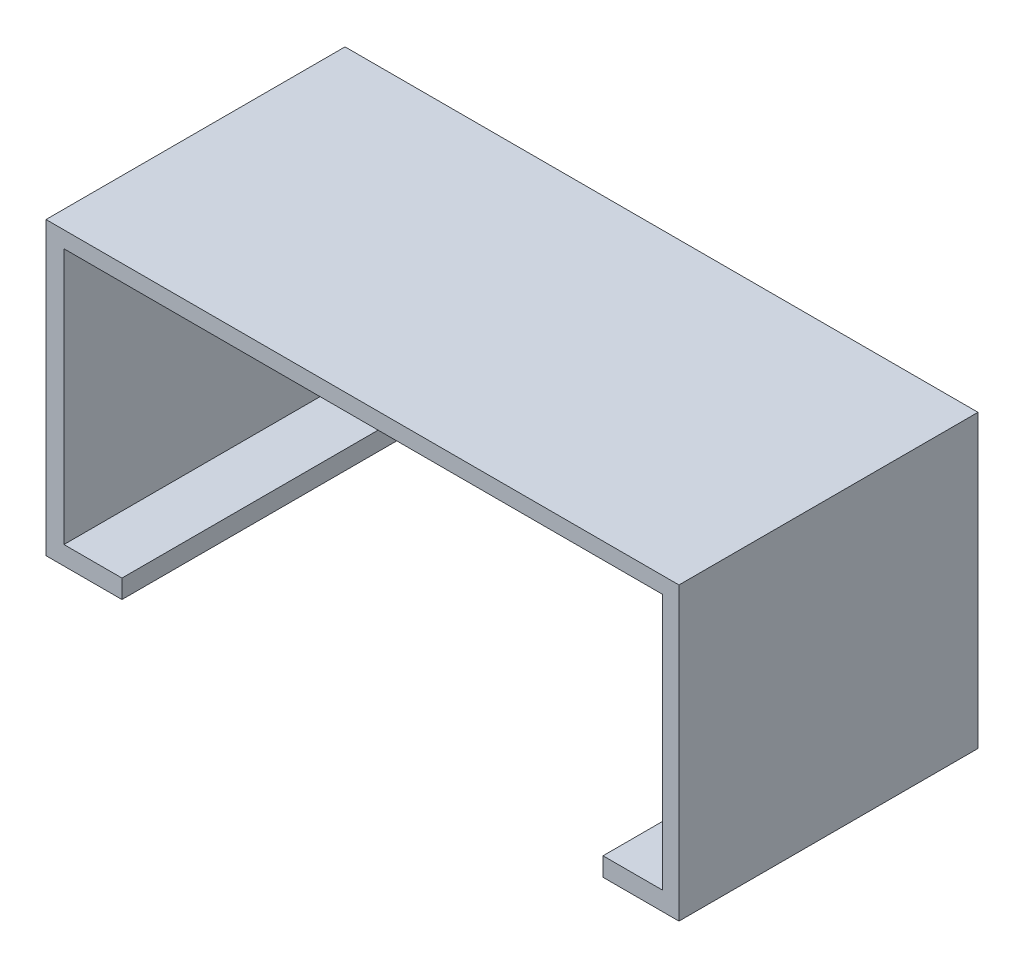
ISO-10303-21;
HEADER;
FILE_DESCRIPTION(('STEP AP214'),'2;1');
FILE_NAME('part.step','',(''),(''),'','','');
FILE_SCHEMA(('AUTOMOTIVE_DESIGN { 1 0 10303 214 1 1 1 1 }'));
ENDSEC;
DATA;
#1=APPLICATION_CONTEXT('core data for automotive mechanical design processes');
#2=APPLICATION_PROTOCOL_DEFINITION('international standard','automotive_design',2000,#1);
#3=PRODUCT_CONTEXT('',#1,'mechanical');
#4=PRODUCT('Part','Part','',(#3));
#5=PRODUCT_RELATED_PRODUCT_CATEGORY('part','',(#4));
#6=PRODUCT_DEFINITION_FORMATION('','',#4);
#7=PRODUCT_DEFINITION_CONTEXT('part definition',#1,'design');
#8=PRODUCT_DEFINITION('design','',#6,#7);
#9=PRODUCT_DEFINITION_SHAPE('','',#8);
#10=(LENGTH_UNIT() NAMED_UNIT(*) SI_UNIT(.MILLI.,.METRE.));
#11=(NAMED_UNIT(*) PLANE_ANGLE_UNIT() SI_UNIT($,.RADIAN.));
#12=(NAMED_UNIT(*) SI_UNIT($,.STERADIAN.) SOLID_ANGLE_UNIT());
#13=UNCERTAINTY_MEASURE_WITH_UNIT(LENGTH_MEASURE(1.E-05),#10,'distance_accuracy_value','');
#14=(GEOMETRIC_REPRESENTATION_CONTEXT(3) GLOBAL_UNCERTAINTY_ASSIGNED_CONTEXT((#13)) GLOBAL_UNIT_ASSIGNED_CONTEXT((#10,
#11,#12)) REPRESENTATION_CONTEXT('',''));
#15=CARTESIAN_POINT('',(0.,0.,0.));
#16=DIRECTION('',(0.,0.,1.));
#17=DIRECTION('',(1.,0.,0.));
#18=AXIS2_PLACEMENT_3D('',#15,#16,#17);
#19=CARTESIAN_POINT('',(-4.826,-2.54700024,0.));
#20=DIRECTION('',(1.,0.,0.));
#21=DIRECTION('',(0.,0.,-1.));
#22=AXIS2_PLACEMENT_3D('',#19,#20,#21);
#23=PLANE('',#22);
#24=DIRECTION('',(0.,0.,-1.));
#25=VECTOR('',#24,1.);
#26=CARTESIAN_POINT('',(-4.826,-2.921,0.));
#27=LINE('',#26,#25);
#28=CARTESIAN_POINT('',(-4.826,-2.921,0.));
#29=VERTEX_POINT('',#28);
#30=CARTESIAN_POINT('',(-4.826,-2.921,6.0000007));
#31=VERTEX_POINT('',#30);
#32=EDGE_CURVE('E157',#29,#31,#27,.F.);
#33=ORIENTED_EDGE('',*,*,#32,.F.);
#34=DIRECTION('',(0.,1.,0.));
#35=VECTOR('',#34,1.);
#36=CARTESIAN_POINT('',(-4.826,-2.54700024,0.));
#37=LINE('',#36,#35);
#38=CARTESIAN_POINT('',(-4.826,-2.54700024,0.));
#39=VERTEX_POINT('',#38);
#40=EDGE_CURVE('E104',#29,#39,#37,.T.);
#41=ORIENTED_EDGE('',*,*,#40,.T.);
#42=DIRECTION('',(0.,0.,1.));
#43=VECTOR('',#42,1.);
#44=CARTESIAN_POINT('',(-4.826,-2.54700024,0.));
#45=LINE('',#44,#43);
#46=CARTESIAN_POINT('',(-4.826,-2.54700024,6.0000007));
#47=VERTEX_POINT('',#46);
#48=EDGE_CURVE('E118',#47,#39,#45,.F.);
#49=ORIENTED_EDGE('',*,*,#48,.F.);
#50=DIRECTION('',(0.,1.,0.));
#51=VECTOR('',#50,1.);
#52=CARTESIAN_POINT('',(-4.826,-2.54700024,6.0000007));
#53=LINE('',#52,#51);
#54=EDGE_CURVE('E20',#47,#31,#53,.F.);
#55=ORIENTED_EDGE('',*,*,#54,.T.);
#56=EDGE_LOOP('',(#33,#41,#49,#55));
#57=FACE_BOUND('',#56,.T.);
#58=ADVANCED_FACE('F17',(#57),#23,.T.);
#59=CARTESIAN_POINT('',(4.826,-2.921,0.));
#60=DIRECTION('',(-1.,0.,0.));
#61=DIRECTION('',(0.,0.,1.));
#62=AXIS2_PLACEMENT_3D('',#59,#60,#61);
#63=PLANE('',#62);
#64=DIRECTION('',(0.,0.,1.));
#65=VECTOR('',#64,1.);
#66=CARTESIAN_POINT('',(4.826,-2.54700024,0.));
#67=LINE('',#66,#65);
#68=CARTESIAN_POINT('',(4.826,-2.54700024,0.));
#69=VERTEX_POINT('',#68);
#70=CARTESIAN_POINT('',(4.826,-2.54700024,6.0000007));
#71=VERTEX_POINT('',#70);
#72=EDGE_CURVE('E138',#69,#71,#67,.T.);
#73=ORIENTED_EDGE('',*,*,#72,.F.);
#74=DIRECTION('',(0.,1.,0.));
#75=VECTOR('',#74,1.);
#76=CARTESIAN_POINT('',(4.826,-2.921,0.));
#77=LINE('',#76,#75);
#78=CARTESIAN_POINT('',(4.826,-2.921,0.));
#79=VERTEX_POINT('',#78);
#80=EDGE_CURVE('E126',#69,#79,#77,.F.);
#81=ORIENTED_EDGE('',*,*,#80,.T.);
#82=DIRECTION('',(0.,0.,-1.));
#83=VECTOR('',#82,1.);
#84=CARTESIAN_POINT('',(4.826,-2.921,0.));
#85=LINE('',#84,#83);
#86=CARTESIAN_POINT('',(4.826,-2.921,6.0000007));
#87=VERTEX_POINT('',#86);
#88=EDGE_CURVE('E141',#87,#79,#85,.T.);
#89=ORIENTED_EDGE('',*,*,#88,.F.);
#90=DIRECTION('',(0.,1.,0.));
#91=VECTOR('',#90,1.);
#92=CARTESIAN_POINT('',(4.826,-2.921,6.0000007));
#93=LINE('',#92,#91);
#94=EDGE_CURVE('E128',#87,#71,#93,.T.);
#95=ORIENTED_EDGE('',*,*,#94,.T.);
#96=EDGE_LOOP('',(#73,#81,#89,#95));
#97=FACE_BOUND('',#96,.T.);
#98=ADVANCED_FACE('F136',(#97),#63,.T.);
#99=CARTESIAN_POINT('',(-5.99000072,-2.54700024,0.));
#100=DIRECTION('',(0.,1.,0.));
#101=DIRECTION('',(0.,0.,1.));
#102=AXIS2_PLACEMENT_3D('',#99,#100,#101);
#103=PLANE('',#102);
#104=ORIENTED_EDGE('',*,*,#48,.T.);
#105=DIRECTION('',(1.,0.,0.));
#106=VECTOR('',#105,1.);
#107=CARTESIAN_POINT('',(-5.99000072,-2.54700024,0.));
#108=LINE('',#107,#106);
#109=CARTESIAN_POINT('',(-5.99000072,-2.54700024,0.));
#110=VERTEX_POINT('',#109);
#111=EDGE_CURVE('E120',#39,#110,#108,.F.);
#112=ORIENTED_EDGE('',*,*,#111,.T.);
#113=DIRECTION('',(0.,0.,-1.));
#114=VECTOR('',#113,1.);
#115=CARTESIAN_POINT('',(-5.99000072,-2.54700024,0.));
#116=LINE('',#115,#114);
#117=CARTESIAN_POINT('',(-5.99000072,-2.54700024,6.0000007));
#118=VERTEX_POINT('',#117);
#119=EDGE_CURVE('E124',#118,#110,#116,.T.);
#120=ORIENTED_EDGE('',*,*,#119,.F.);
#121=DIRECTION('',(1.,0.,0.));
#122=VECTOR('',#121,1.);
#123=CARTESIAN_POINT('',(-5.99000072,-2.54700024,6.0000007));
#124=LINE('',#123,#122);
#125=EDGE_CURVE('E112',#118,#47,#124,.T.);
#126=ORIENTED_EDGE('',*,*,#125,.T.);
#127=EDGE_LOOP('',(#104,#112,#120,#126));
#128=FACE_BOUND('',#127,.T.);
#129=ADVANCED_FACE('F122',(#128),#103,.T.);
#130=CARTESIAN_POINT('',(4.826,-2.54700024,0.));
#131=DIRECTION('',(0.,1.,0.));
#132=DIRECTION('',(0.,0.,1.));
#133=AXIS2_PLACEMENT_3D('',#130,#131,#132);
#134=PLANE('',#133);
#135=DIRECTION('',(0.,0.,1.));
#136=VECTOR('',#135,1.);
#137=CARTESIAN_POINT('',(6.02000066,-2.54700024,0.));
#138=LINE('',#137,#136);
#139=CARTESIAN_POINT('',(6.02000066,-2.54700024,0.));
#140=VERTEX_POINT('',#139);
#141=CARTESIAN_POINT('',(6.02000066,-2.54700024,6.0000007));
#142=VERTEX_POINT('',#141);
#143=EDGE_CURVE('E170',#140,#142,#138,.T.);
#144=ORIENTED_EDGE('',*,*,#143,.F.);
#145=DIRECTION('',(1.,0.,0.));
#146=VECTOR('',#145,1.);
#147=CARTESIAN_POINT('',(4.826,-2.54700024,0.));
#148=LINE('',#147,#146);
#149=EDGE_CURVE('E151',#140,#69,#148,.F.);
#150=ORIENTED_EDGE('',*,*,#149,.T.);
#151=ORIENTED_EDGE('',*,*,#72,.T.);
#152=DIRECTION('',(1.,0.,0.));
#153=VECTOR('',#152,1.);
#154=CARTESIAN_POINT('',(4.826,-2.54700024,6.0000007));
#155=LINE('',#154,#153);
#156=EDGE_CURVE('E144',#71,#142,#155,.T.);
#157=ORIENTED_EDGE('',*,*,#156,.T.);
#158=EDGE_LOOP('',(#144,#150,#151,#157));
#159=FACE_BOUND('',#158,.T.);
#160=ADVANCED_FACE('F153',(#159),#134,.T.);
#161=CARTESIAN_POINT('',(-4.826,-2.921,0.));
#162=DIRECTION('',(0.,-1.,0.));
#163=DIRECTION('',(0.,0.,-1.));
#164=AXIS2_PLACEMENT_3D('',#161,#162,#163);
#165=PLANE('',#164);
#166=DIRECTION('',(0.,0.,1.));
#167=VECTOR('',#166,1.);
#168=CARTESIAN_POINT('',(-6.35,-2.921,0.));
#169=LINE('',#168,#167);
#170=CARTESIAN_POINT('',(-6.35,-2.921,0.));
#171=VERTEX_POINT('',#170);
#172=CARTESIAN_POINT('',(-6.35,-2.921,6.0000007));
#173=VERTEX_POINT('',#172);
#174=EDGE_CURVE('E175',#171,#173,#169,.T.);
#175=ORIENTED_EDGE('',*,*,#174,.F.);
#176=DIRECTION('',(1.,0.,0.));
#177=VECTOR('',#176,1.);
#178=CARTESIAN_POINT('',(-4.826,-2.921,0.));
#179=LINE('',#178,#177);
#180=EDGE_CURVE('E160',#171,#29,#179,.T.);
#181=ORIENTED_EDGE('',*,*,#180,.T.);
#182=ORIENTED_EDGE('',*,*,#32,.T.);
#183=DIRECTION('',(1.,0.,0.));
#184=VECTOR('',#183,1.);
#185=CARTESIAN_POINT('',(-4.826,-2.921,6.0000007));
#186=LINE('',#185,#184);
#187=EDGE_CURVE('E115',#31,#173,#186,.F.);
#188=ORIENTED_EDGE('',*,*,#187,.T.);
#189=EDGE_LOOP('',(#175,#181,#182,#188));
#190=FACE_BOUND('',#189,.T.);
#191=ADVANCED_FACE('F225',(#190),#165,.T.);
#192=CARTESIAN_POINT('',(6.35,-2.921,0.));
#193=DIRECTION('',(0.,-1.,0.));
#194=DIRECTION('',(0.,0.,-1.));
#195=AXIS2_PLACEMENT_3D('',#192,#193,#194);
#196=PLANE('',#195);
#197=ORIENTED_EDGE('',*,*,#88,.T.);
#198=DIRECTION('',(1.,0.,0.));
#199=VECTOR('',#198,1.);
#200=CARTESIAN_POINT('',(6.35,-2.921,0.));
#201=LINE('',#200,#199);
#202=CARTESIAN_POINT('',(6.35,-2.921,0.));
#203=VERTEX_POINT('',#202);
#204=EDGE_CURVE('E164',#79,#203,#201,.T.);
#205=ORIENTED_EDGE('',*,*,#204,.T.);
#206=DIRECTION('',(0.,0.,-1.));
#207=VECTOR('',#206,1.);
#208=CARTESIAN_POINT('',(6.35,-2.921,0.));
#209=LINE('',#208,#207);
#210=CARTESIAN_POINT('',(6.35,-2.921,6.0000007));
#211=VERTEX_POINT('',#210);
#212=EDGE_CURVE('E190',#211,#203,#209,.T.);
#213=ORIENTED_EDGE('',*,*,#212,.F.);
#214=DIRECTION('',(1.,0.,0.));
#215=VECTOR('',#214,1.);
#216=CARTESIAN_POINT('',(6.35,-2.921,6.0000007));
#217=LINE('',#216,#215);
#218=EDGE_CURVE('E185',#87,#211,#217,.T.);
#219=ORIENTED_EDGE('',*,*,#218,.F.);
#220=EDGE_LOOP('',(#197,#205,#213,#219));
#221=FACE_BOUND('',#220,.T.);
#222=ADVANCED_FACE('F216',(#221),#196,.T.);
#223=CARTESIAN_POINT('',(-5.99000072,2.59299964,0.));
#224=DIRECTION('',(1.,0.,0.));
#225=DIRECTION('',(0.,0.,-1.));
#226=AXIS2_PLACEMENT_3D('',#223,#224,#225);
#227=PLANE('',#226);
#228=ORIENTED_EDGE('',*,*,#119,.T.);
#229=DIRECTION('',(0.,1.,0.));
#230=VECTOR('',#229,1.);
#231=CARTESIAN_POINT('',(-5.99000072,2.921,0.));
#232=LINE('',#231,#230);
#233=CARTESIAN_POINT('',(-5.99000072,2.59299964,0.));
#234=VERTEX_POINT('',#233);
#235=EDGE_CURVE('E195',#110,#234,#232,.T.);
#236=ORIENTED_EDGE('',*,*,#235,.T.);
#237=DIRECTION('',(0.,0.,-1.));
#238=VECTOR('',#237,1.);
#239=CARTESIAN_POINT('',(-5.99000072,2.59299964,0.));
#240=LINE('',#239,#238);
#241=CARTESIAN_POINT('',(-5.99000072,2.59299964,6.0000007));
#242=VERTEX_POINT('',#241);
#243=EDGE_CURVE('E167',#242,#234,#240,.T.);
#244=ORIENTED_EDGE('',*,*,#243,.F.);
#245=DIRECTION('',(0.,1.,0.));
#246=VECTOR('',#245,1.);
#247=CARTESIAN_POINT('',(-5.99000072,2.921,6.0000007));
#248=LINE('',#247,#246);
#249=EDGE_CURVE('E180',#118,#242,#248,.T.);
#250=ORIENTED_EDGE('',*,*,#249,.F.);
#251=EDGE_LOOP('',(#228,#236,#244,#250));
#252=FACE_BOUND('',#251,.T.);
#253=ADVANCED_FACE('F233',(#252),#227,.T.);
#254=CARTESIAN_POINT('',(6.02000066,2.59299964,0.));
#255=DIRECTION('',(0.,-1.,0.));
#256=DIRECTION('',(0.,0.,-1.));
#257=AXIS2_PLACEMENT_3D('',#254,#255,#256);
#258=PLANE('',#257);
#259=ORIENTED_EDGE('',*,*,#243,.T.);
#260=DIRECTION('',(1.,0.,0.));
#261=VECTOR('',#260,1.);
#262=CARTESIAN_POINT('',(6.35,2.59299964,0.));
#263=LINE('',#262,#261);
#264=CARTESIAN_POINT('',(6.02000066,2.59299964,0.));
#265=VERTEX_POINT('',#264);
#266=EDGE_CURVE('E197',#234,#265,#263,.T.);
#267=ORIENTED_EDGE('',*,*,#266,.T.);
#268=DIRECTION('',(0.,0.,1.));
#269=VECTOR('',#268,1.);
#270=CARTESIAN_POINT('',(6.02000066,2.59299964,0.));
#271=LINE('',#270,#269);
#272=CARTESIAN_POINT('',(6.02000066,2.59299964,6.0000007));
#273=VERTEX_POINT('',#272);
#274=EDGE_CURVE('E172',#273,#265,#271,.F.);
#275=ORIENTED_EDGE('',*,*,#274,.F.);
#276=DIRECTION('',(1.,0.,0.));
#277=VECTOR('',#276,1.);
#278=CARTESIAN_POINT('',(6.35,2.59299964,6.0000007));
#279=LINE('',#278,#277);
#280=EDGE_CURVE('E182',#242,#273,#279,.T.);
#281=ORIENTED_EDGE('',*,*,#280,.F.);
#282=EDGE_LOOP('',(#259,#267,#275,#281));
#283=FACE_BOUND('',#282,.T.);
#284=ADVANCED_FACE('F252',(#283),#258,.T.);
#285=CARTESIAN_POINT('',(6.02000066,-2.54700024,0.));
#286=DIRECTION('',(-1.,0.,0.));
#287=DIRECTION('',(0.,0.,1.));
#288=AXIS2_PLACEMENT_3D('',#285,#286,#287);
#289=PLANE('',#288);
#290=ORIENTED_EDGE('',*,*,#274,.T.);
#291=DIRECTION('',(0.,1.,0.));
#292=VECTOR('',#291,1.);
#293=CARTESIAN_POINT('',(6.02000066,2.921,0.));
#294=LINE('',#293,#292);
#295=EDGE_CURVE('E199',#265,#140,#294,.F.);
#296=ORIENTED_EDGE('',*,*,#295,.T.);
#297=ORIENTED_EDGE('',*,*,#143,.T.);
#298=DIRECTION('',(0.,1.,0.));
#299=VECTOR('',#298,1.);
#300=CARTESIAN_POINT('',(6.02000066,2.921,6.0000007));
#301=LINE('',#300,#299);
#302=EDGE_CURVE('E147',#273,#142,#301,.F.);
#303=ORIENTED_EDGE('',*,*,#302,.F.);
#304=EDGE_LOOP('',(#290,#296,#297,#303));
#305=FACE_BOUND('',#304,.T.);
#306=ADVANCED_FACE('F249',(#305),#289,.T.);
#307=CARTESIAN_POINT('',(-6.35,-2.921,0.));
#308=DIRECTION('',(-1.,0.,0.));
#309=DIRECTION('',(0.,0.,1.));
#310=AXIS2_PLACEMENT_3D('',#307,#308,#309);
#311=PLANE('',#310);
#312=DIRECTION('',(0.,0.,1.));
#313=VECTOR('',#312,1.);
#314=CARTESIAN_POINT('',(-6.35,2.921,0.));
#315=LINE('',#314,#313);
#316=CARTESIAN_POINT('',(-6.35,2.921,0.));
#317=VERTEX_POINT('',#316);
#318=CARTESIAN_POINT('',(-6.35,2.921,6.0000007));
#319=VERTEX_POINT('',#318);
#320=EDGE_CURVE('E203',#317,#319,#315,.T.);
#321=ORIENTED_EDGE('',*,*,#320,.F.);
#322=DIRECTION('',(0.,1.,0.));
#323=VECTOR('',#322,1.);
#324=CARTESIAN_POINT('',(-6.35,2.921,0.));
#325=LINE('',#324,#323);
#326=EDGE_CURVE('E192',#317,#171,#325,.F.);
#327=ORIENTED_EDGE('',*,*,#326,.T.);
#328=ORIENTED_EDGE('',*,*,#174,.T.);
#329=DIRECTION('',(0.,1.,0.));
#330=VECTOR('',#329,1.);
#331=CARTESIAN_POINT('',(-6.35,2.921,6.0000007));
#332=LINE('',#331,#330);
#333=EDGE_CURVE('E178',#319,#173,#332,.F.);
#334=ORIENTED_EDGE('',*,*,#333,.F.);
#335=EDGE_LOOP('',(#321,#327,#328,#334));
#336=FACE_BOUND('',#335,.T.);
#337=ADVANCED_FACE('F223',(#336),#311,.T.);
#338=CARTESIAN_POINT('',(6.35,2.921,6.0000007));
#339=DIRECTION('',(0.,0.,1.));
#340=DIRECTION('',(1.,0.,0.));
#341=AXIS2_PLACEMENT_3D('',#338,#339,#340);
#342=PLANE('',#341);
#343=ORIENTED_EDGE('',*,*,#218,.T.);
#344=DIRECTION('',(0.,1.,0.));
#345=VECTOR('',#344,1.);
#346=CARTESIAN_POINT('',(6.35,2.921,6.0000007));
#347=LINE('',#346,#345);
#348=CARTESIAN_POINT('',(6.35,2.921,6.0000007));
#349=VERTEX_POINT('',#348);
#350=EDGE_CURVE('E187',#349,#211,#347,.F.);
#351=ORIENTED_EDGE('',*,*,#350,.F.);
#352=DIRECTION('',(1.,0.,0.));
#353=VECTOR('',#352,1.);
#354=CARTESIAN_POINT('',(-6.35,2.921,6.0000007));
#355=LINE('',#354,#353);
#356=EDGE_CURVE('E206',#319,#349,#355,.T.);
#357=ORIENTED_EDGE('',*,*,#356,.F.);
#358=ORIENTED_EDGE('',*,*,#333,.T.);
#359=ORIENTED_EDGE('',*,*,#187,.F.);
#360=ORIENTED_EDGE('',*,*,#54,.F.);
#361=ORIENTED_EDGE('',*,*,#125,.F.);
#362=ORIENTED_EDGE('',*,*,#249,.T.);
#363=ORIENTED_EDGE('',*,*,#280,.T.);
#364=ORIENTED_EDGE('',*,*,#302,.T.);
#365=ORIENTED_EDGE('',*,*,#156,.F.);
#366=ORIENTED_EDGE('',*,*,#94,.F.);
#367=EDGE_LOOP('',(#343,#351,#357,#358,#359,#360,#361,#362,#363,#364,#365,#366));
#368=FACE_BOUND('',#367,.T.);
#369=ADVANCED_FACE('F109',(#368),#342,.T.);
#370=CARTESIAN_POINT('',(6.35,2.921,0.));
#371=DIRECTION('',(1.,0.,0.));
#372=DIRECTION('',(0.,0.,-1.));
#373=AXIS2_PLACEMENT_3D('',#370,#371,#372);
#374=PLANE('',#373);
#375=ORIENTED_EDGE('',*,*,#212,.T.);
#376=DIRECTION('',(0.,1.,0.));
#377=VECTOR('',#376,1.);
#378=CARTESIAN_POINT('',(6.35,2.921,0.));
#379=LINE('',#378,#377);
#380=CARTESIAN_POINT('',(6.35,2.921,0.));
#381=VERTEX_POINT('',#380);
#382=EDGE_CURVE('E35',#203,#381,#379,.T.);
#383=ORIENTED_EDGE('',*,*,#382,.T.);
#384=DIRECTION('',(0.,0.,1.));
#385=VECTOR('',#384,1.);
#386=CARTESIAN_POINT('',(6.35,2.921,0.));
#387=LINE('',#386,#385);
#388=EDGE_CURVE('E26',#349,#381,#387,.F.);
#389=ORIENTED_EDGE('',*,*,#388,.F.);
#390=ORIENTED_EDGE('',*,*,#350,.T.);
#391=EDGE_LOOP('',(#375,#383,#389,#390));
#392=FACE_BOUND('',#391,.T.);
#393=ADVANCED_FACE('F213',(#392),#374,.T.);
#394=CARTESIAN_POINT('',(6.35,2.921,0.));
#395=DIRECTION('',(0.,0.,1.));
#396=DIRECTION('',(1.,0.,0.));
#397=AXIS2_PLACEMENT_3D('',#394,#395,#396);
#398=PLANE('',#397);
#399=ORIENTED_EDGE('',*,*,#204,.F.);
#400=ORIENTED_EDGE('',*,*,#80,.F.);
#401=ORIENTED_EDGE('',*,*,#149,.F.);
#402=ORIENTED_EDGE('',*,*,#295,.F.);
#403=ORIENTED_EDGE('',*,*,#266,.F.);
#404=ORIENTED_EDGE('',*,*,#235,.F.);
#405=ORIENTED_EDGE('',*,*,#111,.F.);
#406=ORIENTED_EDGE('',*,*,#40,.F.);
#407=ORIENTED_EDGE('',*,*,#180,.F.);
#408=ORIENTED_EDGE('',*,*,#326,.F.);
#409=DIRECTION('',(1.,0.,0.));
#410=VECTOR('',#409,1.);
#411=CARTESIAN_POINT('',(-6.35,2.921,0.));
#412=LINE('',#411,#410);
#413=EDGE_CURVE('E11',#381,#317,#412,.F.);
#414=ORIENTED_EDGE('',*,*,#413,.F.);
#415=ORIENTED_EDGE('',*,*,#382,.F.);
#416=EDGE_LOOP('',(#399,#400,#401,#402,#403,#404,#405,#406,#407,#408,#414,#415));
#417=FACE_BOUND('',#416,.T.);
#418=ADVANCED_FACE('F219',(#417),#398,.F.);
#419=CARTESIAN_POINT('',(-6.35,2.921,0.));
#420=DIRECTION('',(0.,1.,0.));
#421=DIRECTION('',(0.,0.,1.));
#422=AXIS2_PLACEMENT_3D('',#419,#420,#421);
#423=PLANE('',#422);
#424=ORIENTED_EDGE('',*,*,#388,.T.);
#425=ORIENTED_EDGE('',*,*,#413,.T.);
#426=ORIENTED_EDGE('',*,*,#320,.T.);
#427=ORIENTED_EDGE('',*,*,#356,.T.);
#428=EDGE_LOOP('',(#424,#425,#426,#427));
#429=FACE_BOUND('',#428,.T.);
#430=ADVANCED_FACE('F211',(#429),#423,.T.);
#431=CLOSED_SHELL('',(#58,#98,#129,#160,#191,#222,#253,#284,#306,#337,#369,#393,#418,#430));
#432=MANIFOLD_SOLID_BREP('B1',#431);
#433=ADVANCED_BREP_SHAPE_REPRESENTATION('',(#18,#432),#14);
#434=SHAPE_DEFINITION_REPRESENTATION(#9,#433);
ENDSEC;
END-ISO-10303-21;
